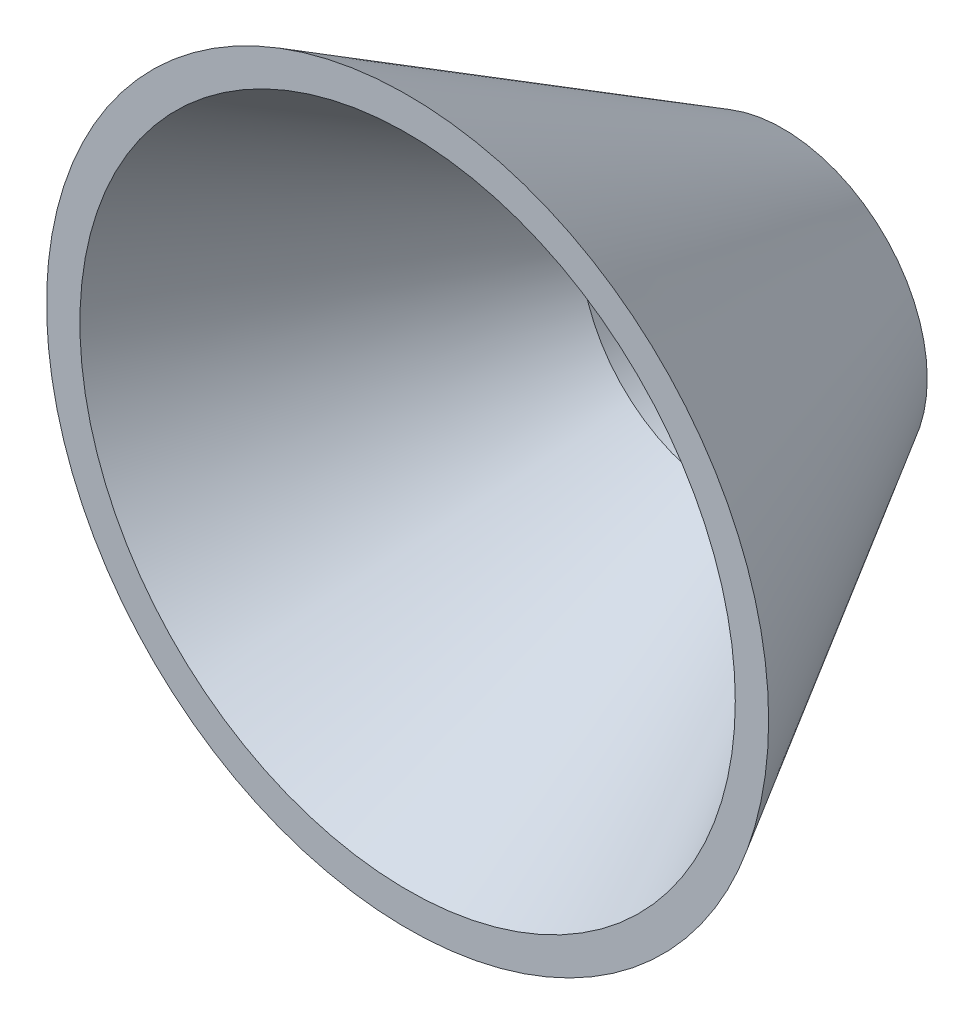
ISO-10303-21;
HEADER;
FILE_DESCRIPTION(('STEP AP214'),'2;1');
FILE_NAME('part.step','',(''),(''),'','','');
FILE_SCHEMA(('AUTOMOTIVE_DESIGN { 1 0 10303 214 1 1 1 1 }'));
ENDSEC;
DATA;
#1=APPLICATION_CONTEXT('core data for automotive mechanical design processes');
#2=APPLICATION_PROTOCOL_DEFINITION('international standard','automotive_design',2000,#1);
#3=PRODUCT_CONTEXT('',#1,'mechanical');
#4=PRODUCT('Part','Part','',(#3));
#5=PRODUCT_RELATED_PRODUCT_CATEGORY('part','',(#4));
#6=PRODUCT_DEFINITION_FORMATION('','',#4);
#7=PRODUCT_DEFINITION_CONTEXT('part definition',#1,'design');
#8=PRODUCT_DEFINITION('design','',#6,#7);
#9=PRODUCT_DEFINITION_SHAPE('','',#8);
#10=(LENGTH_UNIT() NAMED_UNIT(*) SI_UNIT(.MILLI.,.METRE.));
#11=(NAMED_UNIT(*) PLANE_ANGLE_UNIT() SI_UNIT($,.RADIAN.));
#12=(NAMED_UNIT(*) SI_UNIT($,.STERADIAN.) SOLID_ANGLE_UNIT());
#13=UNCERTAINTY_MEASURE_WITH_UNIT(LENGTH_MEASURE(1.E-05),#10,'distance_accuracy_value','');
#14=(GEOMETRIC_REPRESENTATION_CONTEXT(3) GLOBAL_UNCERTAINTY_ASSIGNED_CONTEXT((#13)) GLOBAL_UNIT_ASSIGNED_CONTEXT((#10,
#11,#12)) REPRESENTATION_CONTEXT('',''));
#15=CARTESIAN_POINT('',(0.,0.,0.));
#16=DIRECTION('',(0.,0.,1.));
#17=DIRECTION('',(1.,0.,0.));
#18=AXIS2_PLACEMENT_3D('',#15,#16,#17);
#19=CARTESIAN_POINT('',(0.,0.,0.));
#20=DIRECTION('',(0.,0.,1.));
#21=DIRECTION('',(1.,0.,0.));
#22=AXIS2_PLACEMENT_3D('',#19,#20,#21);
#23=CONICAL_SURFACE('',#22,25.,0.5235987755983);
#24=CARTESIAN_POINT('',(0.,0.,-25.9807621135331));
#25=DIRECTION('',(0.,0.,1.));
#26=DIRECTION('',(1.,0.,0.));
#27=AXIS2_PLACEMENT_3D('',#24,#25,#26);
#28=CIRCLE('',#27,10.);
#29=CARTESIAN_POINT('',(10.,0.,-25.9807621135331));
#30=VERTEX_POINT('',#29);
#31=EDGE_CURVE('E50',#30,#30,#28,.F.);
#32=ORIENTED_EDGE('',*,*,#31,.F.);
#33=EDGE_LOOP('',(#32));
#34=FACE_BOUND('',#33,.T.);
#35=CARTESIAN_POINT('',(0.,0.,0.));
#36=DIRECTION('',(0.,0.,1.));
#37=DIRECTION('',(1.,0.,0.));
#38=AXIS2_PLACEMENT_3D('',#35,#36,#37);
#39=CIRCLE('',#38,25.);
#40=CARTESIAN_POINT('',(25.,0.,0.));
#41=VERTEX_POINT('',#40);
#42=EDGE_CURVE('E10',#41,#41,#39,.T.);
#43=ORIENTED_EDGE('',*,*,#42,.F.);
#44=EDGE_LOOP('',(#43));
#45=FACE_BOUND('',#44,.T.);
#46=ADVANCED_FACE('F39',(#34,#45),#23,.T.);
#47=CARTESIAN_POINT('',(0.,0.,0.));
#48=DIRECTION('',(0.,0.,1.));
#49=DIRECTION('',(1.,0.,0.));
#50=AXIS2_PLACEMENT_3D('',#47,#48,#49);
#51=PLANE('',#50);
#52=CARTESIAN_POINT('',(0.,0.,0.));
#53=DIRECTION('',(0.,0.,1.));
#54=DIRECTION('',(1.,0.,0.));
#55=AXIS2_PLACEMENT_3D('',#52,#53,#54);
#56=CIRCLE('',#55,22.6905989232415);
#57=CARTESIAN_POINT('',(22.6905989232415,0.,0.));
#58=VERTEX_POINT('',#57);
#59=EDGE_CURVE('E46',#58,#58,#56,.T.);
#60=ORIENTED_EDGE('',*,*,#59,.F.);
#61=EDGE_LOOP('',(#60));
#62=FACE_BOUND('',#61,.T.);
#63=ORIENTED_EDGE('',*,*,#42,.T.);
#64=EDGE_LOOP('',(#63));
#65=FACE_BOUND('',#64,.T.);
#66=ADVANCED_FACE('F68',(#62,#65),#51,.T.);
#67=CARTESIAN_POINT('',(0.,0.,1.));
#68=DIRECTION('',(0.,0.,1.));
#69=DIRECTION('',(1.,0.,0.));
#70=AXIS2_PLACEMENT_3D('',#67,#68,#69);
#71=CONICAL_SURFACE('',#70,23.2679491924311,0.5235987755983);
#72=CARTESIAN_POINT('',(0.,0.,-21.9807621135331));
#73=DIRECTION('',(0.,0.,1.));
#74=DIRECTION('',(1.,0.,0.));
#75=AXIS2_PLACEMENT_3D('',#72,#73,#74);
#76=CIRCLE('',#75,10.);
#77=CARTESIAN_POINT('',(10.,0.,-21.9807621135331));
#78=VERTEX_POINT('',#77);
#79=EDGE_CURVE('E42',#78,#78,#76,.F.);
#80=ORIENTED_EDGE('',*,*,#79,.T.);
#81=EDGE_LOOP('',(#80));
#82=FACE_BOUND('',#81,.T.);
#83=ORIENTED_EDGE('',*,*,#59,.T.);
#84=EDGE_LOOP('',(#83));
#85=FACE_BOUND('',#84,.T.);
#86=ADVANCED_FACE('F59',(#82,#85),#71,.F.);
#87=CARTESIAN_POINT('',(0.,0.,-43.3012701892218));
#88=DIRECTION('',(0.,0.,1.));
#89=DIRECTION('',(1.,0.,0.));
#90=AXIS2_PLACEMENT_3D('',#87,#88,#89);
#91=CYLINDRICAL_SURFACE('',#90,10.);
#92=ORIENTED_EDGE('',*,*,#31,.T.);
#93=EDGE_LOOP('',(#92));
#94=FACE_BOUND('',#93,.T.);
#95=ORIENTED_EDGE('',*,*,#79,.F.);
#96=EDGE_LOOP('',(#95));
#97=FACE_BOUND('',#96,.T.);
#98=ADVANCED_FACE('F62',(#94,#97),#91,.F.);
#99=CLOSED_SHELL('',(#46,#66,#86,#98));
#100=MANIFOLD_SOLID_BREP('B2',#99);
#101=ADVANCED_BREP_SHAPE_REPRESENTATION('',(#18,#100),#14);
#102=SHAPE_DEFINITION_REPRESENTATION(#9,#101);
ENDSEC;
END-ISO-10303-21;
